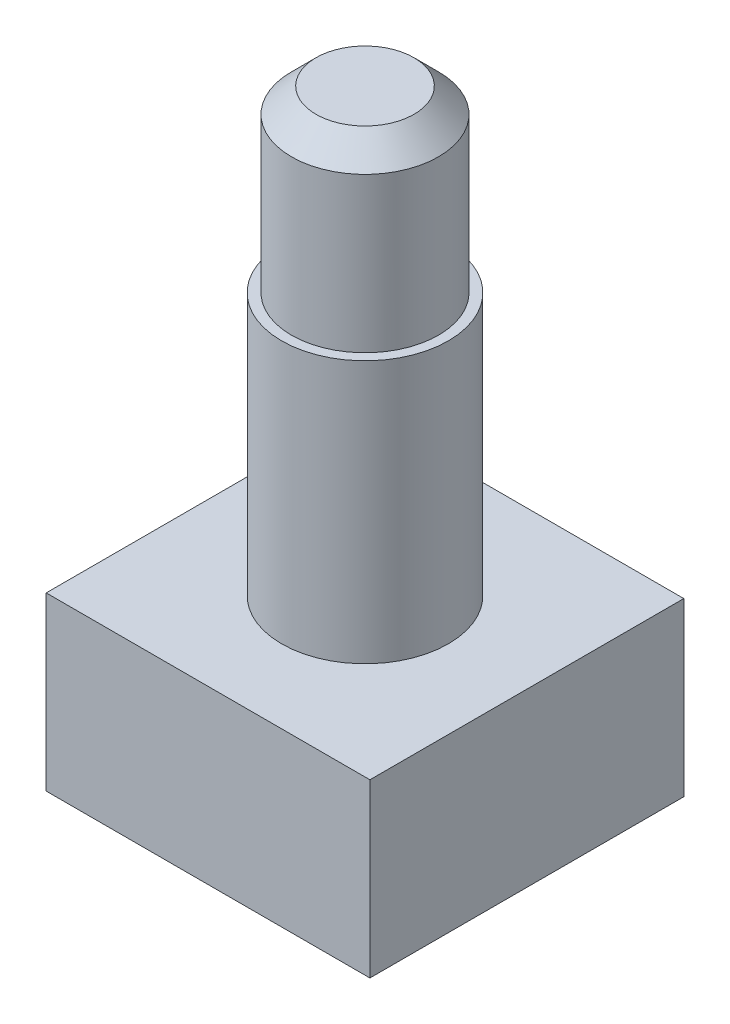
ISO-10303-21;
HEADER;
FILE_DESCRIPTION(('STEP AP214'),'2;1');
FILE_NAME('part.step','',(''),(''),'','','');
FILE_SCHEMA(('AUTOMOTIVE_DESIGN { 1 0 10303 214 1 1 1 1 }'));
ENDSEC;
DATA;
#1=APPLICATION_CONTEXT('core data for automotive mechanical design processes');
#2=APPLICATION_PROTOCOL_DEFINITION('international standard','automotive_design',2000,#1);
#3=PRODUCT_CONTEXT('',#1,'mechanical');
#4=PRODUCT('Part','Part','',(#3));
#5=PRODUCT_RELATED_PRODUCT_CATEGORY('part','',(#4));
#6=PRODUCT_DEFINITION_FORMATION('','',#4);
#7=PRODUCT_DEFINITION_CONTEXT('part definition',#1,'design');
#8=PRODUCT_DEFINITION('design','',#6,#7);
#9=PRODUCT_DEFINITION_SHAPE('','',#8);
#10=(LENGTH_UNIT() NAMED_UNIT(*) SI_UNIT(.MILLI.,.METRE.));
#11=(NAMED_UNIT(*) PLANE_ANGLE_UNIT() SI_UNIT($,.RADIAN.));
#12=(NAMED_UNIT(*) SI_UNIT($,.STERADIAN.) SOLID_ANGLE_UNIT());
#13=UNCERTAINTY_MEASURE_WITH_UNIT(LENGTH_MEASURE(1.E-05),#10,'distance_accuracy_value','');
#14=(GEOMETRIC_REPRESENTATION_CONTEXT(3) GLOBAL_UNCERTAINTY_ASSIGNED_CONTEXT((#13)) GLOBAL_UNIT_ASSIGNED_CONTEXT((#10,
#11,#12)) REPRESENTATION_CONTEXT('',''));
#15=CARTESIAN_POINT('',(0.,0.,0.));
#16=DIRECTION('',(0.,0.,1.));
#17=DIRECTION('',(1.,0.,0.));
#18=AXIS2_PLACEMENT_3D('',#15,#16,#17);
#19=CARTESIAN_POINT('',(6.6,25.,-6.4));
#20=DIRECTION('',(0.,-1.,0.));
#21=DIRECTION('',(0.,0.,-1.));
#22=AXIS2_PLACEMENT_3D('',#19,#20,#21);
#23=CYLINDRICAL_SURFACE('',#22,3.4);
#24=CARTESIAN_POINT('',(6.6,7.,-6.4));
#25=DIRECTION('',(0.,-1.,0.));
#26=DIRECTION('',(0.,0.,-1.));
#27=AXIS2_PLACEMENT_3D('',#24,#25,#26);
#28=CIRCLE('',#27,3.4);
#29=CARTESIAN_POINT('',(6.6,7.,-9.8));
#30=VERTEX_POINT('',#29);
#31=EDGE_CURVE('E11',#30,#30,#28,.F.);
#32=ORIENTED_EDGE('',*,*,#31,.T.);
#33=EDGE_LOOP('',(#32));
#34=FACE_BOUND('',#33,.T.);
#35=CARTESIAN_POINT('',(6.6,17.7,-6.4));
#36=DIRECTION('',(0.,1.,0.));
#37=DIRECTION('',(0.,0.,1.));
#38=AXIS2_PLACEMENT_3D('',#35,#36,#37);
#39=CIRCLE('',#38,3.4);
#40=CARTESIAN_POINT('',(6.6,17.7,-3.));
#41=VERTEX_POINT('',#40);
#42=EDGE_CURVE('E104',#41,#41,#39,.T.);
#43=ORIENTED_EDGE('',*,*,#42,.F.);
#44=EDGE_LOOP('',(#43));
#45=FACE_BOUND('',#44,.T.);
#46=ADVANCED_FACE('F33',(#34,#45),#23,.T.);
#47=CARTESIAN_POINT('',(0.,7.,0.));
#48=DIRECTION('',(0.,-1.,0.));
#49=DIRECTION('',(0.,0.,-1.));
#50=AXIS2_PLACEMENT_3D('',#47,#48,#49);
#51=PLANE('',#50);
#52=DIRECTION('',(0.,0.,1.));
#53=VECTOR('',#52,1.);
#54=CARTESIAN_POINT('',(0.,7.,0.));
#55=LINE('',#54,#53);
#56=CARTESIAN_POINT('',(0.,7.,-12.8));
#57=VERTEX_POINT('',#56);
#58=CARTESIAN_POINT('',(0.,7.,0.));
#59=VERTEX_POINT('',#58);
#60=EDGE_CURVE('E87',#57,#59,#55,.T.);
#61=ORIENTED_EDGE('',*,*,#60,.T.);
#62=DIRECTION('',(1.,0.,0.));
#63=VECTOR('',#62,1.);
#64=CARTESIAN_POINT('',(0.,7.,0.));
#65=LINE('',#64,#63);
#66=CARTESIAN_POINT('',(13.2,7.,0.));
#67=VERTEX_POINT('',#66);
#68=EDGE_CURVE('E81',#59,#67,#65,.T.);
#69=ORIENTED_EDGE('',*,*,#68,.T.);
#70=DIRECTION('',(0.,0.,-1.));
#71=VECTOR('',#70,1.);
#72=CARTESIAN_POINT('',(13.2,7.,0.));
#73=LINE('',#72,#71);
#74=CARTESIAN_POINT('',(13.2,7.,-12.8));
#75=VERTEX_POINT('',#74);
#76=EDGE_CURVE('E85',#67,#75,#73,.T.);
#77=ORIENTED_EDGE('',*,*,#76,.T.);
#78=DIRECTION('',(-1.,0.,0.));
#79=VECTOR('',#78,1.);
#80=CARTESIAN_POINT('',(0.,7.,-12.8));
#81=LINE('',#80,#79);
#82=EDGE_CURVE('E50',#75,#57,#81,.T.);
#83=ORIENTED_EDGE('',*,*,#82,.T.);
#84=EDGE_LOOP('',(#61,#69,#77,#83));
#85=FACE_BOUND('',#84,.T.);
#86=ORIENTED_EDGE('',*,*,#31,.F.);
#87=EDGE_LOOP('',(#86));
#88=FACE_BOUND('',#87,.T.);
#89=ADVANCED_FACE('F82',(#85,#88),#51,.F.);
#90=CARTESIAN_POINT('',(0.,7.,0.));
#91=DIRECTION('',(1.,0.,0.));
#92=DIRECTION('',(0.,0.,-1.));
#93=AXIS2_PLACEMENT_3D('',#90,#91,#92);
#94=PLANE('',#93);
#95=DIRECTION('',(0.,0.,1.));
#96=VECTOR('',#95,1.);
#97=CARTESIAN_POINT('',(0.,0.,0.));
#98=LINE('',#97,#96);
#99=CARTESIAN_POINT('',(0.,0.,-12.8));
#100=VERTEX_POINT('',#99);
#101=CARTESIAN_POINT('',(0.,0.,0.));
#102=VERTEX_POINT('',#101);
#103=EDGE_CURVE('E101',#100,#102,#98,.T.);
#104=ORIENTED_EDGE('',*,*,#103,.T.);
#105=DIRECTION('',(0.,-1.,0.));
#106=VECTOR('',#105,1.);
#107=CARTESIAN_POINT('',(0.,7.,0.));
#108=LINE('',#107,#106);
#109=EDGE_CURVE('E42',#59,#102,#108,.T.);
#110=ORIENTED_EDGE('',*,*,#109,.F.);
#111=ORIENTED_EDGE('',*,*,#60,.F.);
#112=DIRECTION('',(0.,-1.,0.));
#113=VECTOR('',#112,1.);
#114=CARTESIAN_POINT('',(0.,7.,-12.8));
#115=LINE('',#114,#113);
#116=EDGE_CURVE('E97',#57,#100,#115,.T.);
#117=ORIENTED_EDGE('',*,*,#116,.T.);
#118=EDGE_LOOP('',(#104,#110,#111,#117));
#119=FACE_BOUND('',#118,.T.);
#120=ADVANCED_FACE('F35',(#119),#94,.F.);
#121=CARTESIAN_POINT('',(0.,7.,0.));
#122=DIRECTION('',(0.,0.,-1.));
#123=DIRECTION('',(-1.,0.,0.));
#124=AXIS2_PLACEMENT_3D('',#121,#122,#123);
#125=PLANE('',#124);
#126=DIRECTION('',(1.,0.,0.));
#127=VECTOR('',#126,1.);
#128=CARTESIAN_POINT('',(0.,0.,0.));
#129=LINE('',#128,#127);
#130=CARTESIAN_POINT('',(13.2,0.,0.));
#131=VERTEX_POINT('',#130);
#132=EDGE_CURVE('E92',#102,#131,#129,.T.);
#133=ORIENTED_EDGE('',*,*,#132,.T.);
#134=DIRECTION('',(0.,-1.,0.));
#135=VECTOR('',#134,1.);
#136=CARTESIAN_POINT('',(13.2,7.,0.));
#137=LINE('',#136,#135);
#138=EDGE_CURVE('E90',#67,#131,#137,.T.);
#139=ORIENTED_EDGE('',*,*,#138,.F.);
#140=ORIENTED_EDGE('',*,*,#68,.F.);
#141=ORIENTED_EDGE('',*,*,#109,.T.);
#142=EDGE_LOOP('',(#133,#139,#140,#141));
#143=FACE_BOUND('',#142,.T.);
#144=ADVANCED_FACE('F91',(#143),#125,.F.);
#145=CARTESIAN_POINT('',(13.2,7.,0.));
#146=DIRECTION('',(-1.,0.,0.));
#147=DIRECTION('',(0.,0.,1.));
#148=AXIS2_PLACEMENT_3D('',#145,#146,#147);
#149=PLANE('',#148);
#150=DIRECTION('',(0.,0.,-1.));
#151=VECTOR('',#150,1.);
#152=CARTESIAN_POINT('',(13.2,0.,0.));
#153=LINE('',#152,#151);
#154=CARTESIAN_POINT('',(13.2,0.,-12.8));
#155=VERTEX_POINT('',#154);
#156=EDGE_CURVE('E67',#131,#155,#153,.T.);
#157=ORIENTED_EDGE('',*,*,#156,.T.);
#158=DIRECTION('',(0.,-1.,0.));
#159=VECTOR('',#158,1.);
#160=CARTESIAN_POINT('',(13.2,7.,-12.8));
#161=LINE('',#160,#159);
#162=EDGE_CURVE('E93',#75,#155,#161,.T.);
#163=ORIENTED_EDGE('',*,*,#162,.F.);
#164=ORIENTED_EDGE('',*,*,#76,.F.);
#165=ORIENTED_EDGE('',*,*,#138,.T.);
#166=EDGE_LOOP('',(#157,#163,#164,#165));
#167=FACE_BOUND('',#166,.T.);
#168=ADVANCED_FACE('F95',(#167),#149,.F.);
#169=CARTESIAN_POINT('',(0.,7.,-12.8));
#170=DIRECTION('',(0.,0.,1.));
#171=DIRECTION('',(1.,0.,0.));
#172=AXIS2_PLACEMENT_3D('',#169,#170,#171);
#173=PLANE('',#172);
#174=DIRECTION('',(-1.,0.,0.));
#175=VECTOR('',#174,1.);
#176=CARTESIAN_POINT('',(0.,0.,-12.8));
#177=LINE('',#176,#175);
#178=EDGE_CURVE('E73',#155,#100,#177,.T.);
#179=ORIENTED_EDGE('',*,*,#178,.T.);
#180=ORIENTED_EDGE('',*,*,#116,.F.);
#181=ORIENTED_EDGE('',*,*,#82,.F.);
#182=ORIENTED_EDGE('',*,*,#162,.T.);
#183=EDGE_LOOP('',(#179,#180,#181,#182));
#184=FACE_BOUND('',#183,.T.);
#185=ADVANCED_FACE('F115',(#184),#173,.F.);
#186=CARTESIAN_POINT('',(0.,0.,0.));
#187=DIRECTION('',(0.,-1.,0.));
#188=DIRECTION('',(0.,0.,-1.));
#189=AXIS2_PLACEMENT_3D('',#186,#187,#188);
#190=PLANE('',#189);
#191=ORIENTED_EDGE('',*,*,#103,.F.);
#192=ORIENTED_EDGE('',*,*,#178,.F.);
#193=ORIENTED_EDGE('',*,*,#156,.F.);
#194=ORIENTED_EDGE('',*,*,#132,.F.);
#195=EDGE_LOOP('',(#191,#192,#193,#194));
#196=FACE_BOUND('',#195,.T.);
#197=ADVANCED_FACE('F112',(#196),#190,.T.);
#198=CARTESIAN_POINT('',(6.6,17.7,-6.4));
#199=DIRECTION('',(0.,1.,0.));
#200=DIRECTION('',(0.,0.,1.));
#201=AXIS2_PLACEMENT_3D('',#198,#199,#200);
#202=PLANE('',#201);
#203=CARTESIAN_POINT('',(6.6,17.7,-6.4));
#204=DIRECTION('',(0.,1.,0.));
#205=DIRECTION('',(0.,0.,1.));
#206=AXIS2_PLACEMENT_3D('',#203,#204,#205);
#207=CIRCLE('',#206,3.);
#208=CARTESIAN_POINT('',(6.6,17.7,-3.4));
#209=VERTEX_POINT('',#208);
#210=EDGE_CURVE('E154',#209,#209,#207,.T.);
#211=ORIENTED_EDGE('',*,*,#210,.F.);
#212=EDGE_LOOP('',(#211));
#213=FACE_BOUND('',#212,.T.);
#214=ORIENTED_EDGE('',*,*,#42,.T.);
#215=EDGE_LOOP('',(#214));
#216=FACE_BOUND('',#215,.T.);
#217=ADVANCED_FACE('F114',(#213,#216),#202,.T.);
#218=CARTESIAN_POINT('',(6.6,17.7,-6.4));
#219=DIRECTION('',(0.,1.,0.));
#220=DIRECTION('',(0.,0.,1.));
#221=AXIS2_PLACEMENT_3D('',#218,#219,#220);
#222=CYLINDRICAL_SURFACE('',#221,3.);
#223=CARTESIAN_POINT('',(6.6,24.,-6.4));
#224=DIRECTION('',(0.,-1.,0.));
#225=DIRECTION('',(0.,0.,-1.));
#226=AXIS2_PLACEMENT_3D('',#223,#224,#225);
#227=CIRCLE('',#226,3.);
#228=CARTESIAN_POINT('',(6.6,24.,-9.4));
#229=VERTEX_POINT('',#228);
#230=EDGE_CURVE('E149',#229,#229,#227,.T.);
#231=ORIENTED_EDGE('',*,*,#230,.T.);
#232=EDGE_LOOP('',(#231));
#233=FACE_BOUND('',#232,.T.);
#234=ORIENTED_EDGE('',*,*,#210,.T.);
#235=EDGE_LOOP('',(#234));
#236=FACE_BOUND('',#235,.T.);
#237=ADVANCED_FACE('F121',(#233,#236),#222,.T.);
#238=CARTESIAN_POINT('',(6.6,25.,-6.4));
#239=DIRECTION('',(0.,-1.,0.));
#240=DIRECTION('',(0.,0.,-1.));
#241=AXIS2_PLACEMENT_3D('',#238,#239,#240);
#242=CONICAL_SURFACE('',#241,2.,0.785398163397447);
#243=ORIENTED_EDGE('',*,*,#230,.F.);
#244=EDGE_LOOP('',(#243));
#245=FACE_BOUND('',#244,.T.);
#246=CARTESIAN_POINT('',(6.6,25.,-6.4));
#247=DIRECTION('',(0.,-1.,0.));
#248=DIRECTION('',(0.,0.,-1.));
#249=AXIS2_PLACEMENT_3D('',#246,#247,#248);
#250=CIRCLE('',#249,2.);
#251=CARTESIAN_POINT('',(6.6,25.,-8.4));
#252=VERTEX_POINT('',#251);
#253=EDGE_CURVE('E152',#252,#252,#250,.T.);
#254=ORIENTED_EDGE('',*,*,#253,.T.);
#255=EDGE_LOOP('',(#254));
#256=FACE_BOUND('',#255,.T.);
#257=ADVANCED_FACE('F136',(#245,#256),#242,.T.);
#258=CARTESIAN_POINT('',(6.6,25.,-6.4));
#259=DIRECTION('',(0.,1.,0.));
#260=DIRECTION('',(0.,0.,1.));
#261=AXIS2_PLACEMENT_3D('',#258,#259,#260);
#262=PLANE('',#261);
#263=ORIENTED_EDGE('',*,*,#253,.F.);
#264=EDGE_LOOP('',(#263));
#265=FACE_BOUND('',#264,.T.);
#266=ADVANCED_FACE('F134',(#265),#262,.T.);
#267=CLOSED_SHELL('',(#46,#89,#120,#144,#168,#185,#197,#217,#237,#257,#266));
#268=MANIFOLD_SOLID_BREP('B2',#267);
#269=ADVANCED_BREP_SHAPE_REPRESENTATION('',(#18,#268),#14);
#270=SHAPE_DEFINITION_REPRESENTATION(#9,#269);
ENDSEC;
END-ISO-10303-21;
